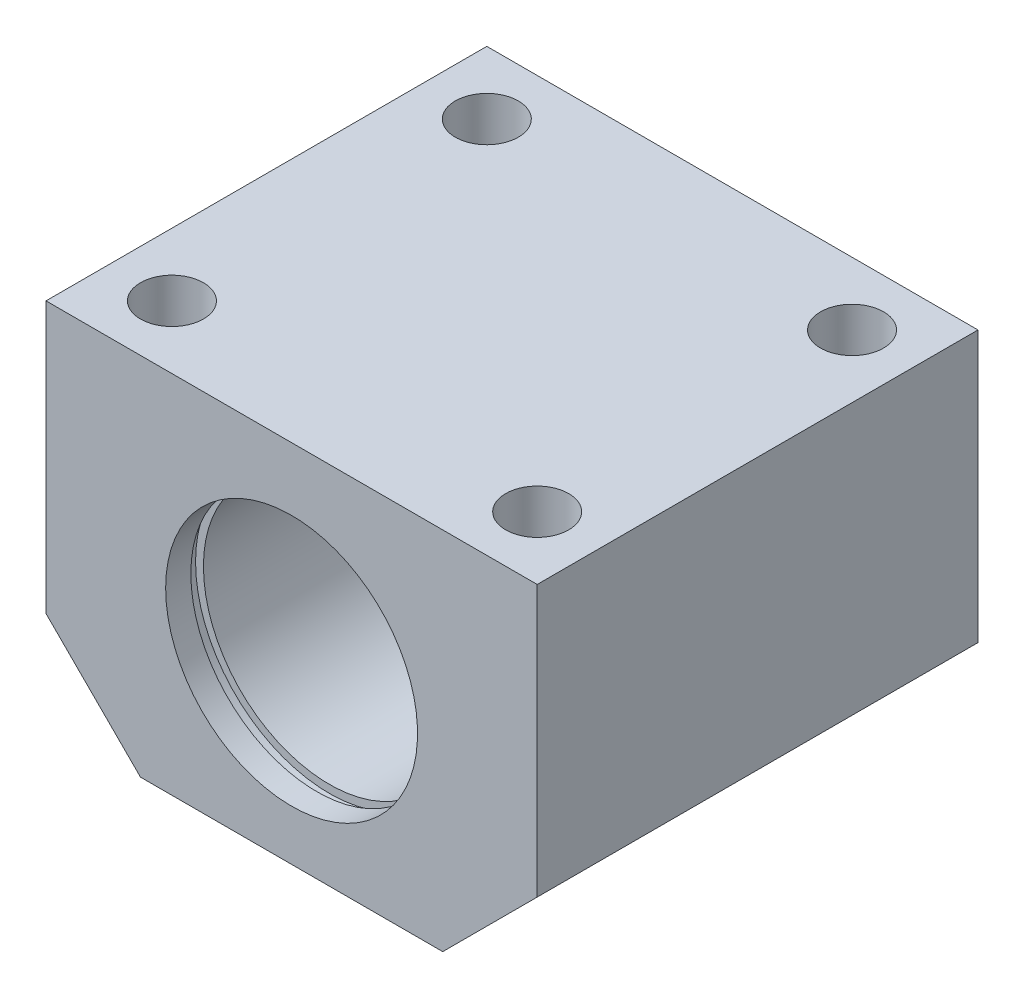
ISO-10303-21;
HEADER;
FILE_DESCRIPTION(('STEP AP214'),'2;1');
FILE_NAME('part.step','',(''),(''),'','','');
FILE_SCHEMA(('AUTOMOTIVE_DESIGN { 1 0 10303 214 1 1 1 1 }'));
ENDSEC;
DATA;
#1=APPLICATION_CONTEXT('core data for automotive mechanical design processes');
#2=APPLICATION_PROTOCOL_DEFINITION('international standard','automotive_design',2000,#1);
#3=PRODUCT_CONTEXT('',#1,'mechanical');
#4=PRODUCT('Part','Part','',(#3));
#5=PRODUCT_RELATED_PRODUCT_CATEGORY('part','',(#4));
#6=PRODUCT_DEFINITION_FORMATION('','',#4);
#7=PRODUCT_DEFINITION_CONTEXT('part definition',#1,'design');
#8=PRODUCT_DEFINITION('design','',#6,#7);
#9=PRODUCT_DEFINITION_SHAPE('','',#8);
#10=(LENGTH_UNIT() NAMED_UNIT(*) SI_UNIT(.MILLI.,.METRE.));
#11=(NAMED_UNIT(*) PLANE_ANGLE_UNIT() SI_UNIT($,.RADIAN.));
#12=(NAMED_UNIT(*) SI_UNIT($,.STERADIAN.) SOLID_ANGLE_UNIT());
#13=UNCERTAINTY_MEASURE_WITH_UNIT(LENGTH_MEASURE(1.E-05),#10,'distance_accuracy_value','');
#14=(GEOMETRIC_REPRESENTATION_CONTEXT(3) GLOBAL_UNCERTAINTY_ASSIGNED_CONTEXT((#13)) GLOBAL_UNIT_ASSIGNED_CONTEXT((#10,
#11,#12)) REPRESENTATION_CONTEXT('',''));
#15=CARTESIAN_POINT('',(0.,0.,0.));
#16=DIRECTION('',(0.,0.,1.));
#17=DIRECTION('',(1.,0.,0.));
#18=AXIS2_PLACEMENT_3D('',#15,#16,#17);
#19=CARTESIAN_POINT('',(0.,28.,35.));
#20=DIRECTION('',(0.,0.,-1.));
#21=DIRECTION('',(-1.,0.,0.));
#22=AXIS2_PLACEMENT_3D('',#19,#20,#21);
#23=CYLINDRICAL_SURFACE('',#22,20.);
#24=CARTESIAN_POINT('',(0.,28.,-29.));
#25=DIRECTION('',(0.,0.,-1.));
#26=DIRECTION('',(-1.,0.,0.));
#27=AXIS2_PLACEMENT_3D('',#24,#25,#26);
#28=CIRCLE('',#27,20.);
#29=CARTESIAN_POINT('',(-20.,28.,-29.));
#30=VERTEX_POINT('',#29);
#31=EDGE_CURVE('E133',#30,#30,#28,.F.);
#32=ORIENTED_EDGE('',*,*,#31,.F.);
#33=EDGE_LOOP('',(#32));
#34=FACE_BOUND('',#33,.T.);
#35=CARTESIAN_POINT('',(0.,28.,29.));
#36=DIRECTION('',(0.,0.,1.));
#37=DIRECTION('',(1.,0.,0.));
#38=AXIS2_PLACEMENT_3D('',#35,#36,#37);
#39=CIRCLE('',#38,20.);
#40=CARTESIAN_POINT('',(20.,28.,29.));
#41=VERTEX_POINT('',#40);
#42=EDGE_CURVE('E125',#41,#41,#39,.F.);
#43=ORIENTED_EDGE('',*,*,#42,.F.);
#44=EDGE_LOOP('',(#43));
#45=FACE_BOUND('',#44,.T.);
#46=ADVANCED_FACE('F17',(#34,#45),#23,.F.);
#47=CARTESIAN_POINT('',(0.,28.,31.));
#48=DIRECTION('',(0.,0.,1.));
#49=DIRECTION('',(1.,0.,0.));
#50=AXIS2_PLACEMENT_3D('',#47,#48,#49);
#51=CIRCLE('',#50,20.);
#52=CARTESIAN_POINT('',(20.,28.,31.));
#53=VERTEX_POINT('',#52);
#54=EDGE_CURVE('E129',#53,#53,#51,.F.);
#55=ORIENTED_EDGE('',*,*,#54,.T.);
#56=EDGE_LOOP('',(#55));
#57=FACE_BOUND('',#56,.T.);
#58=CARTESIAN_POINT('',(0.,28.,35.));
#59=DIRECTION('',(0.,0.,-1.));
#60=DIRECTION('',(-1.,0.,0.));
#61=AXIS2_PLACEMENT_3D('',#58,#59,#60);
#62=CIRCLE('',#61,20.);
#63=CARTESIAN_POINT('',(-20.,28.,35.));
#64=VERTEX_POINT('',#63);
#65=EDGE_CURVE('E156',#64,#64,#62,.T.);
#66=ORIENTED_EDGE('',*,*,#65,.F.);
#67=EDGE_LOOP('',(#66));
#68=FACE_BOUND('',#67,.T.);
#69=ADVANCED_FACE('F231',(#57,#68),#23,.F.);
#70=CARTESIAN_POINT('',(39.,58.,35.));
#71=DIRECTION('',(-1.,0.,0.));
#72=DIRECTION('',(0.,0.,1.));
#73=AXIS2_PLACEMENT_3D('',#70,#71,#72);
#74=PLANE('',#73);
#75=DIRECTION('',(0.,-1.,0.));
#76=VECTOR('',#75,1.);
#77=CARTESIAN_POINT('',(39.,58.,35.));
#78=LINE('',#77,#76);
#79=CARTESIAN_POINT('',(39.,58.,35.));
#80=VERTEX_POINT('',#79);
#81=CARTESIAN_POINT('',(39.,15.,35.));
#82=VERTEX_POINT('',#81);
#83=EDGE_CURVE('E148',#80,#82,#78,.T.);
#84=ORIENTED_EDGE('',*,*,#83,.T.);
#85=DIRECTION('',(0.,0.,-1.));
#86=VECTOR('',#85,1.);
#87=CARTESIAN_POINT('',(39.,15.,-35.));
#88=LINE('',#87,#86);
#89=CARTESIAN_POINT('',(39.,15.,-35.));
#90=VERTEX_POINT('',#89);
#91=EDGE_CURVE('E278',#82,#90,#88,.T.);
#92=ORIENTED_EDGE('',*,*,#91,.T.);
#93=DIRECTION('',(0.,-1.,0.));
#94=VECTOR('',#93,1.);
#95=CARTESIAN_POINT('',(39.,58.,-35.));
#96=LINE('',#95,#94);
#97=CARTESIAN_POINT('',(39.,58.,-35.));
#98=VERTEX_POINT('',#97);
#99=EDGE_CURVE('E124',#98,#90,#96,.T.);
#100=ORIENTED_EDGE('',*,*,#99,.F.);
#101=DIRECTION('',(0.,0.,-1.));
#102=VECTOR('',#101,1.);
#103=CARTESIAN_POINT('',(39.,58.,35.));
#104=LINE('',#103,#102);
#105=EDGE_CURVE('E154',#80,#98,#104,.T.);
#106=ORIENTED_EDGE('',*,*,#105,.F.);
#107=EDGE_LOOP('',(#84,#92,#100,#106));
#108=FACE_BOUND('',#107,.T.);
#109=ADVANCED_FACE('F240',(#108),#74,.F.);
#110=CARTESIAN_POINT('',(-39.,58.,-35.));
#111=DIRECTION('',(0.,0.,1.));
#112=DIRECTION('',(1.,0.,0.));
#113=AXIS2_PLACEMENT_3D('',#110,#111,#112);
#114=PLANE('',#113);
#115=CARTESIAN_POINT('',(0.,28.,-35.));
#116=DIRECTION('',(0.,0.,-1.));
#117=DIRECTION('',(-1.,0.,0.));
#118=AXIS2_PLACEMENT_3D('',#115,#116,#117);
#119=CIRCLE('',#118,20.);
#120=CARTESIAN_POINT('',(-20.,28.,-35.));
#121=VERTEX_POINT('',#120);
#122=EDGE_CURVE('E136',#121,#121,#119,.T.);
#123=ORIENTED_EDGE('',*,*,#122,.F.);
#124=EDGE_LOOP('',(#123));
#125=FACE_BOUND('',#124,.T.);
#126=DIRECTION('',(-1.,0.,0.));
#127=VECTOR('',#126,1.);
#128=CARTESIAN_POINT('',(-39.,0.,-35.));
#129=LINE('',#128,#127);
#130=CARTESIAN_POINT('',(24.,0.,-35.));
#131=VERTEX_POINT('',#130);
#132=CARTESIAN_POINT('',(-24.,0.,-35.));
#133=VERTEX_POINT('',#132);
#134=EDGE_CURVE('E104',#131,#133,#129,.T.);
#135=ORIENTED_EDGE('',*,*,#134,.T.);
#136=DIRECTION('',(-0.707106781186549,0.707106781186546,0.));
#137=VECTOR('',#136,1.);
#138=CARTESIAN_POINT('',(-39.,15.,-35.));
#139=LINE('',#138,#137);
#140=CARTESIAN_POINT('',(-39.,15.,-35.));
#141=VERTEX_POINT('',#140);
#142=EDGE_CURVE('E270',#133,#141,#139,.T.);
#143=ORIENTED_EDGE('',*,*,#142,.T.);
#144=DIRECTION('',(0.,-1.,0.));
#145=VECTOR('',#144,1.);
#146=CARTESIAN_POINT('',(-39.,58.,-35.));
#147=LINE('',#146,#145);
#148=CARTESIAN_POINT('',(-39.,58.,-35.));
#149=VERTEX_POINT('',#148);
#150=EDGE_CURVE('E143',#149,#141,#147,.T.);
#151=ORIENTED_EDGE('',*,*,#150,.F.);
#152=DIRECTION('',(-1.,0.,0.));
#153=VECTOR('',#152,1.);
#154=CARTESIAN_POINT('',(-39.,58.,-35.));
#155=LINE('',#154,#153);
#156=EDGE_CURVE('E160',#98,#149,#155,.T.);
#157=ORIENTED_EDGE('',*,*,#156,.F.);
#158=ORIENTED_EDGE('',*,*,#99,.T.);
#159=DIRECTION('',(-0.707106781186549,-0.707106781186546,0.));
#160=VECTOR('',#159,1.);
#161=CARTESIAN_POINT('',(39.,15.,-35.));
#162=LINE('',#161,#160);
#163=EDGE_CURVE('E271',#90,#131,#162,.T.);
#164=ORIENTED_EDGE('',*,*,#163,.T.);
#165=EDGE_LOOP('',(#135,#143,#151,#157,#158,#164));
#166=FACE_BOUND('',#165,.T.);
#167=ADVANCED_FACE('F263',(#125,#166),#114,.F.);
#168=CARTESIAN_POINT('',(-39.,58.,35.));
#169=DIRECTION('',(1.,0.,0.));
#170=DIRECTION('',(0.,0.,-1.));
#171=AXIS2_PLACEMENT_3D('',#168,#169,#170);
#172=PLANE('',#171);
#173=ORIENTED_EDGE('',*,*,#150,.T.);
#174=DIRECTION('',(0.,0.,1.));
#175=VECTOR('',#174,1.);
#176=CARTESIAN_POINT('',(-39.,15.,35.));
#177=LINE('',#176,#175);
#178=CARTESIAN_POINT('',(-39.,15.,35.));
#179=VERTEX_POINT('',#178);
#180=EDGE_CURVE('E119',#141,#179,#177,.T.);
#181=ORIENTED_EDGE('',*,*,#180,.T.);
#182=DIRECTION('',(0.,-1.,0.));
#183=VECTOR('',#182,1.);
#184=CARTESIAN_POINT('',(-39.,58.,35.));
#185=LINE('',#184,#183);
#186=CARTESIAN_POINT('',(-39.,58.,35.));
#187=VERTEX_POINT('',#186);
#188=EDGE_CURVE('E146',#187,#179,#185,.T.);
#189=ORIENTED_EDGE('',*,*,#188,.F.);
#190=DIRECTION('',(0.,0.,1.));
#191=VECTOR('',#190,1.);
#192=CARTESIAN_POINT('',(-39.,58.,35.));
#193=LINE('',#192,#191);
#194=EDGE_CURVE('E158',#149,#187,#193,.T.);
#195=ORIENTED_EDGE('',*,*,#194,.F.);
#196=EDGE_LOOP('',(#173,#181,#189,#195));
#197=FACE_BOUND('',#196,.T.);
#198=ADVANCED_FACE('F266',(#197),#172,.F.);
#199=CARTESIAN_POINT('',(-39.,58.,35.));
#200=DIRECTION('',(0.,0.,-1.));
#201=DIRECTION('',(-1.,0.,0.));
#202=AXIS2_PLACEMENT_3D('',#199,#200,#201);
#203=PLANE('',#202);
#204=ORIENTED_EDGE('',*,*,#65,.T.);
#205=EDGE_LOOP('',(#204));
#206=FACE_BOUND('',#205,.T.);
#207=ORIENTED_EDGE('',*,*,#188,.T.);
#208=DIRECTION('',(0.707106781186549,-0.707106781186546,0.));
#209=VECTOR('',#208,1.);
#210=CARTESIAN_POINT('',(-39.,15.,35.));
#211=LINE('',#210,#209);
#212=CARTESIAN_POINT('',(-24.,0.,35.));
#213=VERTEX_POINT('',#212);
#214=EDGE_CURVE('E112',#179,#213,#211,.T.);
#215=ORIENTED_EDGE('',*,*,#214,.T.);
#216=DIRECTION('',(1.,0.,0.));
#217=VECTOR('',#216,1.);
#218=CARTESIAN_POINT('',(-39.,0.,35.));
#219=LINE('',#218,#217);
#220=CARTESIAN_POINT('',(24.,0.,35.));
#221=VERTEX_POINT('',#220);
#222=EDGE_CURVE('E152',#213,#221,#219,.T.);
#223=ORIENTED_EDGE('',*,*,#222,.T.);
#224=DIRECTION('',(0.707106781186549,0.707106781186546,0.));
#225=VECTOR('',#224,1.);
#226=CARTESIAN_POINT('',(39.,15.,35.));
#227=LINE('',#226,#225);
#228=EDGE_CURVE('E116',#221,#82,#227,.T.);
#229=ORIENTED_EDGE('',*,*,#228,.T.);
#230=ORIENTED_EDGE('',*,*,#83,.F.);
#231=DIRECTION('',(1.,0.,0.));
#232=VECTOR('',#231,1.);
#233=CARTESIAN_POINT('',(-39.,58.,35.));
#234=LINE('',#233,#232);
#235=EDGE_CURVE('E151',#187,#80,#234,.T.);
#236=ORIENTED_EDGE('',*,*,#235,.F.);
#237=EDGE_LOOP('',(#207,#215,#223,#229,#230,#236));
#238=FACE_BOUND('',#237,.T.);
#239=ADVANCED_FACE('F533',(#206,#238),#203,.F.);
#240=CARTESIAN_POINT('',(0.,58.,0.));
#241=DIRECTION('',(0.,-1.,0.));
#242=DIRECTION('',(0.,0.,-1.));
#243=AXIS2_PLACEMENT_3D('',#240,#241,#242);
#244=PLANE('',#243);
#245=CARTESIAN_POINT('',(29.,58.,-25.));
#246=DIRECTION('',(0.,-1.,0.));
#247=DIRECTION('',(0.,0.,-1.));
#248=AXIS2_PLACEMENT_3D('',#245,#246,#247);
#249=CIRCLE('',#248,5.);
#250=CARTESIAN_POINT('',(29.,58.,-30.));
#251=VERTEX_POINT('',#250);
#252=EDGE_CURVE('E211',#251,#251,#249,.T.);
#253=ORIENTED_EDGE('',*,*,#252,.T.);
#254=EDGE_LOOP('',(#253));
#255=FACE_BOUND('',#254,.T.);
#256=CARTESIAN_POINT('',(29.,58.,25.));
#257=DIRECTION('',(0.,-1.,0.));
#258=DIRECTION('',(0.,0.,-1.));
#259=AXIS2_PLACEMENT_3D('',#256,#257,#258);
#260=CIRCLE('',#259,5.);
#261=CARTESIAN_POINT('',(29.,58.,20.));
#262=VERTEX_POINT('',#261);
#263=EDGE_CURVE('E200',#262,#262,#260,.T.);
#264=ORIENTED_EDGE('',*,*,#263,.T.);
#265=EDGE_LOOP('',(#264));
#266=FACE_BOUND('',#265,.T.);
#267=CARTESIAN_POINT('',(-29.,58.,25.));
#268=DIRECTION('',(0.,-1.,0.));
#269=DIRECTION('',(0.,0.,-1.));
#270=AXIS2_PLACEMENT_3D('',#267,#268,#269);
#271=CIRCLE('',#270,5.);
#272=CARTESIAN_POINT('',(-29.,58.,20.));
#273=VERTEX_POINT('',#272);
#274=EDGE_CURVE('E189',#273,#273,#271,.T.);
#275=ORIENTED_EDGE('',*,*,#274,.T.);
#276=EDGE_LOOP('',(#275));
#277=FACE_BOUND('',#276,.T.);
#278=CARTESIAN_POINT('',(-29.,58.,-25.));
#279=DIRECTION('',(0.,-1.,0.));
#280=DIRECTION('',(0.,0.,-1.));
#281=AXIS2_PLACEMENT_3D('',#278,#279,#280);
#282=CIRCLE('',#281,5.);
#283=CARTESIAN_POINT('',(-29.,58.,-30.));
#284=VERTEX_POINT('',#283);
#285=EDGE_CURVE('E175',#284,#284,#282,.T.);
#286=ORIENTED_EDGE('',*,*,#285,.T.);
#287=EDGE_LOOP('',(#286));
#288=FACE_BOUND('',#287,.T.);
#289=ORIENTED_EDGE('',*,*,#105,.T.);
#290=ORIENTED_EDGE('',*,*,#156,.T.);
#291=ORIENTED_EDGE('',*,*,#194,.T.);
#292=ORIENTED_EDGE('',*,*,#235,.T.);
#293=EDGE_LOOP('',(#289,#290,#291,#292));
#294=FACE_BOUND('',#293,.T.);
#295=ADVANCED_FACE('F257',(#255,#266,#277,#288,#294),#244,.F.);
#296=CARTESIAN_POINT('',(0.,0.,0.));
#297=DIRECTION('',(0.,-1.,0.));
#298=DIRECTION('',(0.,0.,-1.));
#299=AXIS2_PLACEMENT_3D('',#296,#297,#298);
#300=PLANE('',#299);
#301=CARTESIAN_POINT('',(29.,0.,-25.));
#302=DIRECTION('',(0.,-1.,0.));
#303=DIRECTION('',(0.,0.,-1.));
#304=AXIS2_PLACEMENT_3D('',#301,#302,#303);
#305=CIRCLE('',#304,7.5);
#306=CARTESIAN_POINT('',(24.,0.,-19.4098300562505));
#307=VERTEX_POINT('',#306);
#308=CARTESIAN_POINT('',(24.,0.,-30.5901699437494));
#309=VERTEX_POINT('',#308);
#310=EDGE_CURVE('E89',#307,#309,#305,.T.);
#311=ORIENTED_EDGE('',*,*,#310,.F.);
#312=DIRECTION('',(0.,0.,1.));
#313=VECTOR('',#312,1.);
#314=CARTESIAN_POINT('',(24.,0.,35.));
#315=LINE('',#314,#313);
#316=CARTESIAN_POINT('',(24.,0.,19.4098300562505));
#317=VERTEX_POINT('',#316);
#318=EDGE_CURVE('E100',#307,#317,#315,.T.);
#319=ORIENTED_EDGE('',*,*,#318,.T.);
#320=CARTESIAN_POINT('',(29.,0.,25.));
#321=DIRECTION('',(0.,-1.,0.));
#322=DIRECTION('',(0.,0.,-1.));
#323=AXIS2_PLACEMENT_3D('',#320,#321,#322);
#324=CIRCLE('',#323,7.5);
#325=CARTESIAN_POINT('',(24.,0.,30.5901699437494));
#326=VERTEX_POINT('',#325);
#327=EDGE_CURVE('E209',#326,#317,#324,.T.);
#328=ORIENTED_EDGE('',*,*,#327,.F.);
#329=EDGE_CURVE('E107',#326,#221,#315,.T.);
#330=ORIENTED_EDGE('',*,*,#329,.T.);
#331=ORIENTED_EDGE('',*,*,#222,.F.);
#332=DIRECTION('',(0.,0.,-1.));
#333=VECTOR('',#332,1.);
#334=CARTESIAN_POINT('',(-24.,0.,-35.));
#335=LINE('',#334,#333);
#336=CARTESIAN_POINT('',(-24.,0.,30.5901699437494));
#337=VERTEX_POINT('',#336);
#338=EDGE_CURVE('E110',#213,#337,#335,.T.);
#339=ORIENTED_EDGE('',*,*,#338,.T.);
#340=CARTESIAN_POINT('',(-29.,0.,25.));
#341=DIRECTION('',(0.,-1.,0.));
#342=DIRECTION('',(0.,0.,-1.));
#343=AXIS2_PLACEMENT_3D('',#340,#341,#342);
#344=CIRCLE('',#343,7.5);
#345=CARTESIAN_POINT('',(-24.,0.,19.4098300562506));
#346=VERTEX_POINT('',#345);
#347=EDGE_CURVE('E198',#346,#337,#344,.T.);
#348=ORIENTED_EDGE('',*,*,#347,.F.);
#349=CARTESIAN_POINT('',(-24.,0.,-19.4098300562506));
#350=VERTEX_POINT('',#349);
#351=EDGE_CURVE('E108',#346,#350,#335,.T.);
#352=ORIENTED_EDGE('',*,*,#351,.T.);
#353=CARTESIAN_POINT('',(-29.,0.,-25.));
#354=DIRECTION('',(0.,-1.,0.));
#355=DIRECTION('',(0.,0.,-1.));
#356=AXIS2_PLACEMENT_3D('',#353,#354,#355);
#357=CIRCLE('',#356,7.5);
#358=CARTESIAN_POINT('',(-24.,0.,-30.5901699437494));
#359=VERTEX_POINT('',#358);
#360=EDGE_CURVE('E186',#359,#350,#357,.T.);
#361=ORIENTED_EDGE('',*,*,#360,.F.);
#362=EDGE_CURVE('E105',#359,#133,#335,.T.);
#363=ORIENTED_EDGE('',*,*,#362,.T.);
#364=ORIENTED_EDGE('',*,*,#134,.F.);
#365=EDGE_CURVE('E99',#131,#309,#315,.T.);
#366=ORIENTED_EDGE('',*,*,#365,.T.);
#367=EDGE_LOOP('',(#311,#319,#328,#330,#331,#339,#348,#352,#361,#363,#364,#366));
#368=FACE_BOUND('',#367,.T.);
#369=ADVANCED_FACE('F102',(#368),#300,.T.);
#370=CARTESIAN_POINT('',(0.,28.,-31.));
#371=DIRECTION('',(0.,0.,-1.));
#372=DIRECTION('',(-1.,0.,0.));
#373=AXIS2_PLACEMENT_3D('',#370,#371,#372);
#374=CIRCLE('',#373,20.);
#375=CARTESIAN_POINT('',(-20.,28.,-31.));
#376=VERTEX_POINT('',#375);
#377=EDGE_CURVE('E137',#376,#376,#374,.F.);
#378=ORIENTED_EDGE('',*,*,#377,.T.);
#379=EDGE_LOOP('',(#378));
#380=FACE_BOUND('',#379,.T.);
#381=ORIENTED_EDGE('',*,*,#122,.T.);
#382=EDGE_LOOP('',(#381));
#383=FACE_BOUND('',#382,.T.);
#384=ADVANCED_FACE('F234',(#380,#383),#23,.F.);
#385=CARTESIAN_POINT('',(0.,28.,-29.));
#386=DIRECTION('',(0.,0.,-1.));
#387=DIRECTION('',(-1.,0.,0.));
#388=AXIS2_PLACEMENT_3D('',#385,#386,#387);
#389=PLANE('',#388);
#390=CARTESIAN_POINT('',(0.,28.,-29.));
#391=DIRECTION('',(0.,0.,-1.));
#392=DIRECTION('',(-1.,0.,0.));
#393=AXIS2_PLACEMENT_3D('',#390,#391,#392);
#394=CIRCLE('',#393,21.25);
#395=CARTESIAN_POINT('',(-21.25,28.,-29.));
#396=VERTEX_POINT('',#395);
#397=EDGE_CURVE('E140',#396,#396,#394,.T.);
#398=ORIENTED_EDGE('',*,*,#397,.T.);
#399=EDGE_LOOP('',(#398));
#400=FACE_BOUND('',#399,.T.);
#401=ORIENTED_EDGE('',*,*,#31,.T.);
#402=EDGE_LOOP('',(#401));
#403=FACE_BOUND('',#402,.T.);
#404=ADVANCED_FACE('F247',(#400,#403),#389,.T.);
#405=CARTESIAN_POINT('',(0.,28.,-31.));
#406=DIRECTION('',(0.,0.,-1.));
#407=DIRECTION('',(-1.,0.,0.));
#408=AXIS2_PLACEMENT_3D('',#405,#406,#407);
#409=PLANE('',#408);
#410=CARTESIAN_POINT('',(0.,28.,-31.));
#411=DIRECTION('',(0.,0.,-1.));
#412=DIRECTION('',(-1.,0.,0.));
#413=AXIS2_PLACEMENT_3D('',#410,#411,#412);
#414=CIRCLE('',#413,21.25);
#415=CARTESIAN_POINT('',(-21.25,28.,-31.));
#416=VERTEX_POINT('',#415);
#417=EDGE_CURVE('E128',#416,#416,#414,.T.);
#418=ORIENTED_EDGE('',*,*,#417,.F.);
#419=EDGE_LOOP('',(#418));
#420=FACE_BOUND('',#419,.T.);
#421=ORIENTED_EDGE('',*,*,#377,.F.);
#422=EDGE_LOOP('',(#421));
#423=FACE_BOUND('',#422,.T.);
#424=ADVANCED_FACE('F254',(#420,#423),#409,.F.);
#425=CARTESIAN_POINT('',(0.,28.,-29.));
#426=DIRECTION('',(0.,0.,-1.));
#427=DIRECTION('',(-1.,0.,0.));
#428=AXIS2_PLACEMENT_3D('',#425,#426,#427);
#429=CYLINDRICAL_SURFACE('',#428,21.25);
#430=ORIENTED_EDGE('',*,*,#397,.F.);
#431=EDGE_LOOP('',(#430));
#432=FACE_BOUND('',#431,.T.);
#433=ORIENTED_EDGE('',*,*,#417,.T.);
#434=EDGE_LOOP('',(#433));
#435=FACE_BOUND('',#434,.T.);
#436=ADVANCED_FACE('F320',(#432,#435),#429,.F.);
#437=CARTESIAN_POINT('',(0.,28.,29.));
#438=DIRECTION('',(0.,0.,1.));
#439=DIRECTION('',(-1.,0.,0.));
#440=AXIS2_PLACEMENT_3D('',#437,#438,#439);
#441=PLANE('',#440);
#442=CARTESIAN_POINT('',(0.,28.,29.));
#443=DIRECTION('',(0.,0.,-1.));
#444=DIRECTION('',(-1.,0.,0.));
#445=AXIS2_PLACEMENT_3D('',#442,#443,#444);
#446=CIRCLE('',#445,21.25);
#447=CARTESIAN_POINT('',(-21.25,28.,29.));
#448=VERTEX_POINT('',#447);
#449=EDGE_CURVE('E132',#448,#448,#446,.T.);
#450=ORIENTED_EDGE('',*,*,#449,.F.);
#451=EDGE_LOOP('',(#450));
#452=FACE_BOUND('',#451,.T.);
#453=ORIENTED_EDGE('',*,*,#42,.T.);
#454=EDGE_LOOP('',(#453));
#455=FACE_BOUND('',#454,.T.);
#456=ADVANCED_FACE('F316',(#452,#455),#441,.T.);
#457=CARTESIAN_POINT('',(0.,28.,31.));
#458=DIRECTION('',(0.,0.,1.));
#459=DIRECTION('',(-1.,0.,0.));
#460=AXIS2_PLACEMENT_3D('',#457,#458,#459);
#461=PLANE('',#460);
#462=CARTESIAN_POINT('',(0.,28.,31.));
#463=DIRECTION('',(0.,0.,-1.));
#464=DIRECTION('',(-1.,0.,0.));
#465=AXIS2_PLACEMENT_3D('',#462,#463,#464);
#466=CIRCLE('',#465,21.25);
#467=CARTESIAN_POINT('',(-21.25,28.,31.));
#468=VERTEX_POINT('',#467);
#469=EDGE_CURVE('E172',#468,#468,#466,.T.);
#470=ORIENTED_EDGE('',*,*,#469,.T.);
#471=EDGE_LOOP('',(#470));
#472=FACE_BOUND('',#471,.T.);
#473=ORIENTED_EDGE('',*,*,#54,.F.);
#474=EDGE_LOOP('',(#473));
#475=FACE_BOUND('',#474,.T.);
#476=ADVANCED_FACE('F319',(#472,#475),#461,.F.);
#477=CARTESIAN_POINT('',(0.,28.,29.));
#478=DIRECTION('',(0.,0.,1.));
#479=DIRECTION('',(1.,0.,0.));
#480=AXIS2_PLACEMENT_3D('',#477,#478,#479);
#481=CYLINDRICAL_SURFACE('',#480,21.25);
#482=ORIENTED_EDGE('',*,*,#449,.T.);
#483=EDGE_LOOP('',(#482));
#484=FACE_BOUND('',#483,.T.);
#485=ORIENTED_EDGE('',*,*,#469,.F.);
#486=EDGE_LOOP('',(#485));
#487=FACE_BOUND('',#486,.T.);
#488=ADVANCED_FACE('F324',(#484,#487),#481,.F.);
#489=CARTESIAN_POINT('',(-39.,15.,35.));
#490=DIRECTION('',(-0.707106781186546,-0.707106781186549,0.));
#491=DIRECTION('',(0.,0.,-1.));
#492=AXIS2_PLACEMENT_3D('',#489,#490,#491);
#493=PLANE('',#492);
#494=CARTESIAN_POINT('',(-29.,5.,25.));
#495=DIRECTION('',(-0.707106781186546,-0.707106781186549,0.));
#496=DIRECTION('',(0.707106781186549,-0.707106781186546,0.));
#497=AXIS2_PLACEMENT_3D('',#494,#495,#496);
#498=ELLIPSE('',#497,10.6066017177982,7.5);
#499=EDGE_CURVE('E286',#337,#346,#498,.T.);
#500=ORIENTED_EDGE('',*,*,#499,.F.);
#501=ORIENTED_EDGE('',*,*,#338,.F.);
#502=ORIENTED_EDGE('',*,*,#214,.F.);
#503=ORIENTED_EDGE('',*,*,#180,.F.);
#504=ORIENTED_EDGE('',*,*,#142,.F.);
#505=ORIENTED_EDGE('',*,*,#362,.F.);
#506=CARTESIAN_POINT('',(-29.,5.,-25.));
#507=DIRECTION('',(-0.707106781186546,-0.707106781186549,0.));
#508=DIRECTION('',(0.707106781186549,-0.707106781186546,0.));
#509=AXIS2_PLACEMENT_3D('',#506,#507,#508);
#510=ELLIPSE('',#509,10.6066017177982,7.5);
#511=EDGE_CURVE('E281',#350,#359,#510,.T.);
#512=ORIENTED_EDGE('',*,*,#511,.F.);
#513=ORIENTED_EDGE('',*,*,#351,.F.);
#514=EDGE_LOOP('',(#500,#501,#502,#503,#504,#505,#512,#513));
#515=FACE_BOUND('',#514,.T.);
#516=ADVANCED_FACE('F276',(#515),#493,.T.);
#517=CARTESIAN_POINT('',(39.,15.,35.));
#518=DIRECTION('',(0.707106781186546,-0.707106781186549,0.));
#519=DIRECTION('',(0.,0.,1.));
#520=AXIS2_PLACEMENT_3D('',#517,#518,#519);
#521=PLANE('',#520);
#522=CARTESIAN_POINT('',(29.,5.,-25.));
#523=DIRECTION('',(0.707106781186546,-0.707106781186549,0.));
#524=DIRECTION('',(-0.707106781186549,-0.707106781186546,0.));
#525=AXIS2_PLACEMENT_3D('',#522,#523,#524);
#526=ELLIPSE('',#525,10.6066017177982,7.5);
#527=EDGE_CURVE('E11',#309,#307,#526,.T.);
#528=ORIENTED_EDGE('',*,*,#527,.F.);
#529=ORIENTED_EDGE('',*,*,#365,.F.);
#530=ORIENTED_EDGE('',*,*,#163,.F.);
#531=ORIENTED_EDGE('',*,*,#91,.F.);
#532=ORIENTED_EDGE('',*,*,#228,.F.);
#533=ORIENTED_EDGE('',*,*,#329,.F.);
#534=CARTESIAN_POINT('',(29.,5.,25.));
#535=DIRECTION('',(0.707106781186546,-0.707106781186549,0.));
#536=DIRECTION('',(-0.707106781186549,-0.707106781186546,0.));
#537=AXIS2_PLACEMENT_3D('',#534,#535,#536);
#538=ELLIPSE('',#537,10.6066017177982,7.5);
#539=EDGE_CURVE('E25',#317,#326,#538,.T.);
#540=ORIENTED_EDGE('',*,*,#539,.F.);
#541=ORIENTED_EDGE('',*,*,#318,.F.);
#542=EDGE_LOOP('',(#528,#529,#530,#531,#532,#533,#540,#541));
#543=FACE_BOUND('',#542,.T.);
#544=ADVANCED_FACE('F19',(#543),#521,.T.);
#545=CARTESIAN_POINT('',(-29.,0.,-25.));
#546=DIRECTION('',(0.,-1.,0.));
#547=DIRECTION('',(0.,0.,-1.));
#548=AXIS2_PLACEMENT_3D('',#545,#546,#547);
#549=CYLINDRICAL_SURFACE('',#548,5.);
#550=ORIENTED_EDGE('',*,*,#285,.F.);
#551=EDGE_LOOP('',(#550));
#552=FACE_BOUND('',#551,.T.);
#553=CARTESIAN_POINT('',(-29.,25.,-25.));
#554=DIRECTION('',(0.,-1.,0.));
#555=DIRECTION('',(0.,0.,-1.));
#556=AXIS2_PLACEMENT_3D('',#553,#554,#555);
#557=CIRCLE('',#556,5.);
#558=CARTESIAN_POINT('',(-29.,25.,-30.));
#559=VERTEX_POINT('',#558);
#560=EDGE_CURVE('E180',#559,#559,#557,.T.);
#561=ORIENTED_EDGE('',*,*,#560,.T.);
#562=EDGE_LOOP('',(#561));
#563=FACE_BOUND('',#562,.T.);
#564=ADVANCED_FACE('F305',(#552,#563),#549,.F.);
#565=CARTESIAN_POINT('',(-24.,25.,-25.));
#566=DIRECTION('',(0.,1.,0.));
#567=DIRECTION('',(0.,0.,1.));
#568=AXIS2_PLACEMENT_3D('',#565,#566,#567);
#569=PLANE('',#568);
#570=ORIENTED_EDGE('',*,*,#560,.F.);
#571=EDGE_LOOP('',(#570));
#572=FACE_BOUND('',#571,.T.);
#573=CARTESIAN_POINT('',(-29.,25.,-25.));
#574=DIRECTION('',(0.,-1.,0.));
#575=DIRECTION('',(0.,0.,-1.));
#576=AXIS2_PLACEMENT_3D('',#573,#574,#575);
#577=CIRCLE('',#576,7.5);
#578=CARTESIAN_POINT('',(-29.,25.,-32.5));
#579=VERTEX_POINT('',#578);
#580=EDGE_CURVE('E183',#579,#579,#577,.T.);
#581=ORIENTED_EDGE('',*,*,#580,.T.);
#582=EDGE_LOOP('',(#581));
#583=FACE_BOUND('',#582,.T.);
#584=ADVANCED_FACE('F300',(#572,#583),#569,.F.);
#585=CARTESIAN_POINT('',(-29.,0.,-25.));
#586=DIRECTION('',(0.,-1.,0.));
#587=DIRECTION('',(0.,0.,-1.));
#588=AXIS2_PLACEMENT_3D('',#585,#586,#587);
#589=CYLINDRICAL_SURFACE('',#588,7.5);
#590=ORIENTED_EDGE('',*,*,#511,.T.);
#591=ORIENTED_EDGE('',*,*,#360,.T.);
#592=EDGE_LOOP('',(#590,#591));
#593=FACE_BOUND('',#592,.T.);
#594=ORIENTED_EDGE('',*,*,#580,.F.);
#595=EDGE_LOOP('',(#594));
#596=FACE_BOUND('',#595,.T.);
#597=ADVANCED_FACE('F296',(#593,#596),#589,.F.);
#598=CARTESIAN_POINT('',(-29.,0.,25.));
#599=DIRECTION('',(0.,-1.,0.));
#600=DIRECTION('',(0.,0.,-1.));
#601=AXIS2_PLACEMENT_3D('',#598,#599,#600);
#602=CYLINDRICAL_SURFACE('',#601,5.);
#603=ORIENTED_EDGE('',*,*,#274,.F.);
#604=EDGE_LOOP('',(#603));
#605=FACE_BOUND('',#604,.T.);
#606=CARTESIAN_POINT('',(-29.,25.,25.));
#607=DIRECTION('',(0.,-1.,0.));
#608=DIRECTION('',(0.,0.,-1.));
#609=AXIS2_PLACEMENT_3D('',#606,#607,#608);
#610=CIRCLE('',#609,5.);
#611=CARTESIAN_POINT('',(-29.,25.,20.));
#612=VERTEX_POINT('',#611);
#613=EDGE_CURVE('E192',#612,#612,#610,.T.);
#614=ORIENTED_EDGE('',*,*,#613,.T.);
#615=EDGE_LOOP('',(#614));
#616=FACE_BOUND('',#615,.T.);
#617=ADVANCED_FACE('F299',(#605,#616),#602,.F.);
#618=CARTESIAN_POINT('',(-24.,25.,25.));
#619=DIRECTION('',(0.,1.,0.));
#620=DIRECTION('',(0.,0.,1.));
#621=AXIS2_PLACEMENT_3D('',#618,#619,#620);
#622=PLANE('',#621);
#623=ORIENTED_EDGE('',*,*,#613,.F.);
#624=EDGE_LOOP('',(#623));
#625=FACE_BOUND('',#624,.T.);
#626=CARTESIAN_POINT('',(-29.,25.,25.));
#627=DIRECTION('',(0.,-1.,0.));
#628=DIRECTION('',(0.,0.,-1.));
#629=AXIS2_PLACEMENT_3D('',#626,#627,#628);
#630=CIRCLE('',#629,7.5);
#631=CARTESIAN_POINT('',(-29.,25.,17.5));
#632=VERTEX_POINT('',#631);
#633=EDGE_CURVE('E195',#632,#632,#630,.T.);
#634=ORIENTED_EDGE('',*,*,#633,.T.);
#635=EDGE_LOOP('',(#634));
#636=FACE_BOUND('',#635,.T.);
#637=ADVANCED_FACE('F402',(#625,#636),#622,.F.);
#638=CARTESIAN_POINT('',(-29.,0.,25.));
#639=DIRECTION('',(0.,-1.,0.));
#640=DIRECTION('',(0.,0.,-1.));
#641=AXIS2_PLACEMENT_3D('',#638,#639,#640);
#642=CYLINDRICAL_SURFACE('',#641,7.5);
#643=ORIENTED_EDGE('',*,*,#499,.T.);
#644=ORIENTED_EDGE('',*,*,#347,.T.);
#645=EDGE_LOOP('',(#643,#644));
#646=FACE_BOUND('',#645,.T.);
#647=ORIENTED_EDGE('',*,*,#633,.F.);
#648=EDGE_LOOP('',(#647));
#649=FACE_BOUND('',#648,.T.);
#650=ADVANCED_FACE('F289',(#646,#649),#642,.F.);
#651=CARTESIAN_POINT('',(29.,0.,25.));
#652=DIRECTION('',(0.,-1.,0.));
#653=DIRECTION('',(0.,0.,-1.));
#654=AXIS2_PLACEMENT_3D('',#651,#652,#653);
#655=CYLINDRICAL_SURFACE('',#654,5.);
#656=ORIENTED_EDGE('',*,*,#263,.F.);
#657=EDGE_LOOP('',(#656));
#658=FACE_BOUND('',#657,.T.);
#659=CARTESIAN_POINT('',(29.,25.,25.));
#660=DIRECTION('',(0.,-1.,0.));
#661=DIRECTION('',(0.,0.,-1.));
#662=AXIS2_PLACEMENT_3D('',#659,#660,#661);
#663=CIRCLE('',#662,5.);
#664=CARTESIAN_POINT('',(29.,25.,20.));
#665=VERTEX_POINT('',#664);
#666=EDGE_CURVE('E203',#665,#665,#663,.T.);
#667=ORIENTED_EDGE('',*,*,#666,.T.);
#668=EDGE_LOOP('',(#667));
#669=FACE_BOUND('',#668,.T.);
#670=ADVANCED_FACE('F422',(#658,#669),#655,.F.);
#671=CARTESIAN_POINT('',(34.,25.,25.));
#672=DIRECTION('',(0.,1.,0.));
#673=DIRECTION('',(0.,0.,1.));
#674=AXIS2_PLACEMENT_3D('',#671,#672,#673);
#675=PLANE('',#674);
#676=ORIENTED_EDGE('',*,*,#666,.F.);
#677=EDGE_LOOP('',(#676));
#678=FACE_BOUND('',#677,.T.);
#679=CARTESIAN_POINT('',(29.,25.,25.));
#680=DIRECTION('',(0.,-1.,0.));
#681=DIRECTION('',(0.,0.,-1.));
#682=AXIS2_PLACEMENT_3D('',#679,#680,#681);
#683=CIRCLE('',#682,7.5);
#684=CARTESIAN_POINT('',(29.,25.,17.5));
#685=VERTEX_POINT('',#684);
#686=EDGE_CURVE('E206',#685,#685,#683,.T.);
#687=ORIENTED_EDGE('',*,*,#686,.T.);
#688=EDGE_LOOP('',(#687));
#689=FACE_BOUND('',#688,.T.);
#690=ADVANCED_FACE('F432',(#678,#689),#675,.F.);
#691=CARTESIAN_POINT('',(29.,0.,25.));
#692=DIRECTION('',(0.,-1.,0.));
#693=DIRECTION('',(0.,0.,-1.));
#694=AXIS2_PLACEMENT_3D('',#691,#692,#693);
#695=CYLINDRICAL_SURFACE('',#694,7.5);
#696=ORIENTED_EDGE('',*,*,#539,.T.);
#697=ORIENTED_EDGE('',*,*,#327,.T.);
#698=EDGE_LOOP('',(#696,#697));
#699=FACE_BOUND('',#698,.T.);
#700=ORIENTED_EDGE('',*,*,#686,.F.);
#701=EDGE_LOOP('',(#700));
#702=FACE_BOUND('',#701,.T.);
#703=ADVANCED_FACE('F443',(#699,#702),#695,.F.);
#704=CARTESIAN_POINT('',(29.,0.,-25.));
#705=DIRECTION('',(0.,-1.,0.));
#706=DIRECTION('',(0.,0.,-1.));
#707=AXIS2_PLACEMENT_3D('',#704,#705,#706);
#708=CYLINDRICAL_SURFACE('',#707,5.);
#709=ORIENTED_EDGE('',*,*,#252,.F.);
#710=EDGE_LOOP('',(#709));
#711=FACE_BOUND('',#710,.T.);
#712=CARTESIAN_POINT('',(29.,25.,-25.));
#713=DIRECTION('',(0.,-1.,0.));
#714=DIRECTION('',(0.,0.,-1.));
#715=AXIS2_PLACEMENT_3D('',#712,#713,#714);
#716=CIRCLE('',#715,5.);
#717=CARTESIAN_POINT('',(29.,25.,-30.));
#718=VERTEX_POINT('',#717);
#719=EDGE_CURVE('E214',#718,#718,#716,.T.);
#720=ORIENTED_EDGE('',*,*,#719,.T.);
#721=EDGE_LOOP('',(#720));
#722=FACE_BOUND('',#721,.T.);
#723=ADVANCED_FACE('F227',(#711,#722),#708,.F.);
#724=CARTESIAN_POINT('',(34.,25.,-25.));
#725=DIRECTION('',(0.,1.,0.));
#726=DIRECTION('',(0.,0.,1.));
#727=AXIS2_PLACEMENT_3D('',#724,#725,#726);
#728=PLANE('',#727);
#729=ORIENTED_EDGE('',*,*,#719,.F.);
#730=EDGE_LOOP('',(#729));
#731=FACE_BOUND('',#730,.T.);
#732=CARTESIAN_POINT('',(29.,25.,-25.));
#733=DIRECTION('',(0.,-1.,0.));
#734=DIRECTION('',(0.,0.,-1.));
#735=AXIS2_PLACEMENT_3D('',#732,#733,#734);
#736=CIRCLE('',#735,7.5);
#737=CARTESIAN_POINT('',(29.,25.,-32.5));
#738=VERTEX_POINT('',#737);
#739=EDGE_CURVE('E95',#738,#738,#736,.T.);
#740=ORIENTED_EDGE('',*,*,#739,.T.);
#741=EDGE_LOOP('',(#740));
#742=FACE_BOUND('',#741,.T.);
#743=ADVANCED_FACE('F220',(#731,#742),#728,.F.);
#744=CARTESIAN_POINT('',(29.,0.,-25.));
#745=DIRECTION('',(0.,-1.,0.));
#746=DIRECTION('',(0.,0.,-1.));
#747=AXIS2_PLACEMENT_3D('',#744,#745,#746);
#748=CYLINDRICAL_SURFACE('',#747,7.5);
#749=ORIENTED_EDGE('',*,*,#527,.T.);
#750=ORIENTED_EDGE('',*,*,#310,.T.);
#751=EDGE_LOOP('',(#749,#750));
#752=FACE_BOUND('',#751,.T.);
#753=ORIENTED_EDGE('',*,*,#739,.F.);
#754=EDGE_LOOP('',(#753));
#755=FACE_BOUND('',#754,.T.);
#756=ADVANCED_FACE('F90',(#752,#755),#748,.F.);
#757=CLOSED_SHELL('',(#46,#69,#109,#167,#198,#239,#295,#369,#384,#404,#424,#436,#456,#476,#488,
#516,#544,#564,#584,#597,#617,#637,#650,#670,#690,#703,#723,#743,#756));
#758=MANIFOLD_SOLID_BREP('B1',#757);
#759=ADVANCED_BREP_SHAPE_REPRESENTATION('',(#18,#758),#14);
#760=SHAPE_DEFINITION_REPRESENTATION(#9,#759);
ENDSEC;
END-ISO-10303-21;
